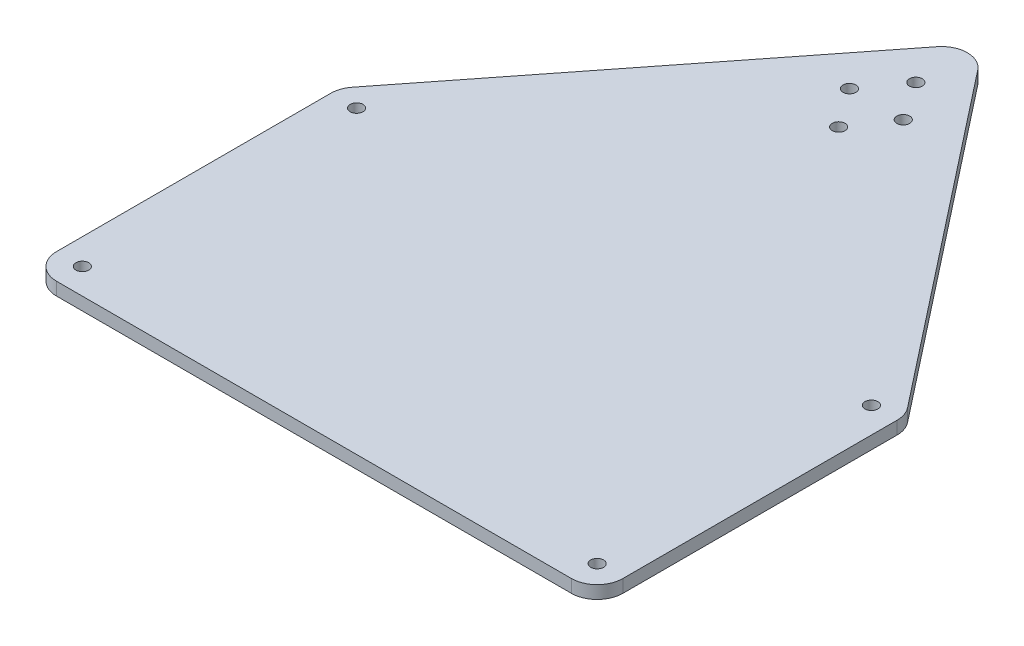
ISO-10303-21;
HEADER;
FILE_DESCRIPTION(('STEP AP214'),'2;1');
FILE_NAME('part.step','',(''),(''),'','','');
FILE_SCHEMA(('AUTOMOTIVE_DESIGN { 1 0 10303 214 1 1 1 1 }'));
ENDSEC;
DATA;
#1=APPLICATION_CONTEXT('core data for automotive mechanical design processes');
#2=APPLICATION_PROTOCOL_DEFINITION('international standard','automotive_design',2000,#1);
#3=PRODUCT_CONTEXT('',#1,'mechanical');
#4=PRODUCT('Part','Part','',(#3));
#5=PRODUCT_RELATED_PRODUCT_CATEGORY('part','',(#4));
#6=PRODUCT_DEFINITION_FORMATION('','',#4);
#7=PRODUCT_DEFINITION_CONTEXT('part definition',#1,'design');
#8=PRODUCT_DEFINITION('design','',#6,#7);
#9=PRODUCT_DEFINITION_SHAPE('','',#8);
#10=(LENGTH_UNIT() NAMED_UNIT(*) SI_UNIT(.MILLI.,.METRE.));
#11=(NAMED_UNIT(*) PLANE_ANGLE_UNIT() SI_UNIT($,.RADIAN.));
#12=(NAMED_UNIT(*) SI_UNIT($,.STERADIAN.) SOLID_ANGLE_UNIT());
#13=UNCERTAINTY_MEASURE_WITH_UNIT(LENGTH_MEASURE(1.E-05),#10,'distance_accuracy_value','');
#14=(GEOMETRIC_REPRESENTATION_CONTEXT(3) GLOBAL_UNCERTAINTY_ASSIGNED_CONTEXT((#13)) GLOBAL_UNIT_ASSIGNED_CONTEXT((#10,
#11,#12)) REPRESENTATION_CONTEXT('',''));
#15=CARTESIAN_POINT('',(0.,0.,0.));
#16=DIRECTION('',(0.,0.,1.));
#17=DIRECTION('',(1.,0.,0.));
#18=AXIS2_PLACEMENT_3D('',#15,#16,#17);
#19=CARTESIAN_POINT('',(-125.579322033898,6.35,-12.7));
#20=DIRECTION('',(0.,-1.,0.));
#21=DIRECTION('',(0.,0.,-1.));
#22=AXIS2_PLACEMENT_3D('',#19,#20,#21);
#23=PLANE('',#22);
#24=CARTESIAN_POINT('',(-125.579322033898,6.35,-12.7));
#25=DIRECTION('',(0.,1.,0.));
#26=DIRECTION('',(0.,0.,-1.));
#27=AXIS2_PLACEMENT_3D('',#24,#25,#26);
#28=CIRCLE('',#27,12.7);
#29=CARTESIAN_POINT('',(-138.279322033898,6.35,-12.7));
#30=VERTEX_POINT('',#29);
#31=CARTESIAN_POINT('',(-125.579322033898,6.35,0.));
#32=VERTEX_POINT('',#31);
#33=EDGE_CURVE('E161',#30,#32,#28,.T.);
#34=ORIENTED_EDGE('',*,*,#33,.T.);
#35=DIRECTION('',(1.,0.,0.));
#36=VECTOR('',#35,1.);
#37=CARTESIAN_POINT('',(-125.579322033898,6.35,0.));
#38=LINE('',#37,#36);
#39=CARTESIAN_POINT('',(128.420677966102,6.35,0.));
#40=VERTEX_POINT('',#39);
#41=EDGE_CURVE('E99',#32,#40,#38,.T.);
#42=ORIENTED_EDGE('',*,*,#41,.T.);
#43=CARTESIAN_POINT('',(128.420677966102,6.35,-12.7));
#44=DIRECTION('',(0.,1.,0.));
#45=DIRECTION('',(0.,0.,1.));
#46=AXIS2_PLACEMENT_3D('',#43,#44,#45);
#47=CIRCLE('',#46,12.7);
#48=CARTESIAN_POINT('',(141.120677966102,6.35,-12.7));
#49=VERTEX_POINT('',#48);
#50=EDGE_CURVE('E182',#40,#49,#47,.T.);
#51=ORIENTED_EDGE('',*,*,#50,.T.);
#52=DIRECTION('',(0.,0.,-1.));
#53=VECTOR('',#52,1.);
#54=CARTESIAN_POINT('',(141.120677966102,6.35,-12.7));
#55=LINE('',#54,#53);
#56=CARTESIAN_POINT('',(141.120677966102,6.35,-148.007538959317));
#57=VERTEX_POINT('',#56);
#58=EDGE_CURVE('E201',#49,#57,#55,.T.);
#59=ORIENTED_EDGE('',*,*,#58,.T.);
#60=CARTESIAN_POINT('',(128.420677966102,6.35,-148.007538959317));
#61=DIRECTION('',(0.,1.,0.));
#62=DIRECTION('',(0.,0.,1.));
#63=AXIS2_PLACEMENT_3D('',#60,#61,#62);
#64=CIRCLE('',#63,12.7);
#65=CARTESIAN_POINT('',(138.406920869146,6.35,-155.853872668852));
#66=VERTEX_POINT('',#65);
#67=EDGE_CURVE('E198',#57,#66,#64,.T.);
#68=ORIENTED_EDGE('',*,*,#67,.T.);
#69=DIRECTION('',(-0.617821551931903,0.,-0.786318338822423));
#70=VECTOR('',#69,1.);
#71=CARTESIAN_POINT('',(138.406920869146,6.35,-155.853872668852));
#72=LINE('',#71,#70);
#73=CARTESIAN_POINT('',(11.4069208691464,6.35,-317.490236305216));
#74=VERTEX_POINT('',#73);
#75=EDGE_CURVE('E200',#66,#74,#72,.T.);
#76=ORIENTED_EDGE('',*,*,#75,.T.);
#77=CARTESIAN_POINT('',(1.42067796610163,6.35,-309.643902595681));
#78=DIRECTION('',(0.,1.,0.));
#79=DIRECTION('',(0.,0.,1.));
#80=AXIS2_PLACEMENT_3D('',#77,#78,#79);
#81=CIRCLE('',#80,12.7);
#82=CARTESIAN_POINT('',(-8.56556493694314,6.35,-317.490236305216));
#83=VERTEX_POINT('',#82);
#84=EDGE_CURVE('E124',#74,#83,#81,.T.);
#85=ORIENTED_EDGE('',*,*,#84,.T.);
#86=DIRECTION('',(-0.617821551931904,0.,0.786318338822423));
#87=VECTOR('',#86,1.);
#88=CARTESIAN_POINT('',(-8.56556493694314,6.35,-317.490236305216));
#89=LINE('',#88,#87);
#90=CARTESIAN_POINT('',(-135.565564936943,6.35,-155.853872668852));
#91=VERTEX_POINT('',#90);
#92=EDGE_CURVE('E118',#83,#91,#89,.T.);
#93=ORIENTED_EDGE('',*,*,#92,.T.);
#94=CARTESIAN_POINT('',(-125.579322033898,6.35,-148.007538959317));
#95=DIRECTION('',(0.,1.,0.));
#96=DIRECTION('',(0.,0.,1.));
#97=AXIS2_PLACEMENT_3D('',#94,#95,#96);
#98=CIRCLE('',#97,12.7);
#99=CARTESIAN_POINT('',(-138.279322033898,6.35,-148.007538959317));
#100=VERTEX_POINT('',#99);
#101=EDGE_CURVE('E122',#91,#100,#98,.T.);
#102=ORIENTED_EDGE('',*,*,#101,.T.);
#103=DIRECTION('',(0.,0.,1.));
#104=VECTOR('',#103,1.);
#105=CARTESIAN_POINT('',(-138.279322033898,6.35,-148.007538959317));
#106=LINE('',#105,#104);
#107=EDGE_CURVE('E50',#100,#30,#106,.T.);
#108=ORIENTED_EDGE('',*,*,#107,.T.);
#109=EDGE_LOOP('',(#34,#42,#51,#59,#68,#76,#85,#93,#102,#108));
#110=FACE_BOUND('',#109,.T.);
#111=CARTESIAN_POINT('',(1.42067796610163,6.35,-296.943902595681));
#112=DIRECTION('',(0.,1.,0.));
#113=DIRECTION('',(0.,0.,1.));
#114=AXIS2_PLACEMENT_3D('',#111,#112,#113);
#115=CIRCLE('',#114,3.175);
#116=CARTESIAN_POINT('',(1.42067796610163,6.35,-293.768902595681));
#117=VERTEX_POINT('',#116);
#118=EDGE_CURVE('E146',#117,#117,#115,.T.);
#119=ORIENTED_EDGE('',*,*,#118,.F.);
#120=EDGE_LOOP('',(#119));
#121=FACE_BOUND('',#120,.T.);
#122=CARTESIAN_POINT('',(-12.2950626967712,6.35,-277.893902595681));
#123=DIRECTION('',(0.,1.,0.));
#124=DIRECTION('',(0.,0.,1.));
#125=AXIS2_PLACEMENT_3D('',#122,#123,#124);
#126=CIRCLE('',#125,3.175);
#127=CARTESIAN_POINT('',(-12.2950626967712,6.35,-274.718902595681));
#128=VERTEX_POINT('',#127);
#129=EDGE_CURVE('E212',#128,#128,#126,.T.);
#130=ORIENTED_EDGE('',*,*,#129,.F.);
#131=EDGE_LOOP('',(#130));
#132=FACE_BOUND('',#131,.T.);
#133=CARTESIAN_POINT('',(14.2584082263258,6.35,-277.893902595681));
#134=DIRECTION('',(0.,1.,0.));
#135=DIRECTION('',(0.,0.,1.));
#136=AXIS2_PLACEMENT_3D('',#133,#134,#135);
#137=CIRCLE('',#136,3.175);
#138=CARTESIAN_POINT('',(14.2584082263258,6.35,-274.718902595681));
#139=VERTEX_POINT('',#138);
#140=EDGE_CURVE('E218',#139,#139,#137,.T.);
#141=ORIENTED_EDGE('',*,*,#140,.F.);
#142=EDGE_LOOP('',(#141));
#143=FACE_BOUND('',#142,.T.);
#144=CARTESIAN_POINT('',(1.42067796610163,6.35,-258.843902595681));
#145=DIRECTION('',(0.,1.,0.));
#146=DIRECTION('',(0.,0.,1.));
#147=AXIS2_PLACEMENT_3D('',#144,#145,#146);
#148=CIRCLE('',#147,3.175);
#149=CARTESIAN_POINT('',(1.42067796610163,6.35,-255.668902595681));
#150=VERTEX_POINT('',#149);
#151=EDGE_CURVE('E224',#150,#150,#148,.T.);
#152=ORIENTED_EDGE('',*,*,#151,.F.);
#153=EDGE_LOOP('',(#152));
#154=FACE_BOUND('',#153,.T.);
#155=CARTESIAN_POINT('',(-125.579322033898,6.35,-148.007538959317));
#156=DIRECTION('',(0.,1.,0.));
#157=DIRECTION('',(0.,0.,1.));
#158=AXIS2_PLACEMENT_3D('',#155,#156,#157);
#159=CIRCLE('',#158,3.175);
#160=CARTESIAN_POINT('',(-125.579322033898,6.35,-144.832538959317));
#161=VERTEX_POINT('',#160);
#162=EDGE_CURVE('E230',#161,#161,#159,.T.);
#163=ORIENTED_EDGE('',*,*,#162,.F.);
#164=EDGE_LOOP('',(#163));
#165=FACE_BOUND('',#164,.T.);
#166=CARTESIAN_POINT('',(128.420677966102,6.35,-148.007538959317));
#167=DIRECTION('',(0.,1.,0.));
#168=DIRECTION('',(0.,0.,1.));
#169=AXIS2_PLACEMENT_3D('',#166,#167,#168);
#170=CIRCLE('',#169,3.175);
#171=CARTESIAN_POINT('',(128.420677966102,6.35,-144.832538959317));
#172=VERTEX_POINT('',#171);
#173=EDGE_CURVE('E236',#172,#172,#170,.T.);
#174=ORIENTED_EDGE('',*,*,#173,.F.);
#175=EDGE_LOOP('',(#174));
#176=FACE_BOUND('',#175,.T.);
#177=CARTESIAN_POINT('',(128.420677966102,6.35,-12.7));
#178=DIRECTION('',(0.,1.,0.));
#179=DIRECTION('',(0.,0.,1.));
#180=AXIS2_PLACEMENT_3D('',#177,#178,#179);
#181=CIRCLE('',#180,3.175);
#182=CARTESIAN_POINT('',(128.420677966102,6.35,-9.525));
#183=VERTEX_POINT('',#182);
#184=EDGE_CURVE('E242',#183,#183,#181,.T.);
#185=ORIENTED_EDGE('',*,*,#184,.F.);
#186=EDGE_LOOP('',(#185));
#187=FACE_BOUND('',#186,.T.);
#188=CARTESIAN_POINT('',(-125.579322033898,6.35,-12.7));
#189=DIRECTION('',(0.,1.,0.));
#190=DIRECTION('',(0.,0.,1.));
#191=AXIS2_PLACEMENT_3D('',#188,#189,#190);
#192=CIRCLE('',#191,3.175);
#193=CARTESIAN_POINT('',(-125.579322033898,6.35,-9.525));
#194=VERTEX_POINT('',#193);
#195=EDGE_CURVE('E248',#194,#194,#192,.T.);
#196=ORIENTED_EDGE('',*,*,#195,.F.);
#197=EDGE_LOOP('',(#196));
#198=FACE_BOUND('',#197,.T.);
#199=ADVANCED_FACE('F33',(#110,#121,#132,#143,#154,#165,#176,#187,#198),#23,.F.);
#200=CARTESIAN_POINT('',(-125.579322033898,0.,-12.7));
#201=DIRECTION('',(0.,-1.,0.));
#202=DIRECTION('',(0.,0.,-1.));
#203=AXIS2_PLACEMENT_3D('',#200,#201,#202);
#204=PLANE('',#203);
#205=CARTESIAN_POINT('',(128.420677966102,0.,-12.7));
#206=DIRECTION('',(0.,1.,0.));
#207=DIRECTION('',(0.,0.,1.));
#208=AXIS2_PLACEMENT_3D('',#205,#206,#207);
#209=CIRCLE('',#208,3.175);
#210=CARTESIAN_POINT('',(128.420677966102,0.,-9.525));
#211=VERTEX_POINT('',#210);
#212=EDGE_CURVE('E245',#211,#211,#209,.T.);
#213=ORIENTED_EDGE('',*,*,#212,.T.);
#214=EDGE_LOOP('',(#213));
#215=FACE_BOUND('',#214,.T.);
#216=CARTESIAN_POINT('',(-125.579322033898,0.,-148.007538959317));
#217=DIRECTION('',(0.,1.,0.));
#218=DIRECTION('',(0.,0.,1.));
#219=AXIS2_PLACEMENT_3D('',#216,#217,#218);
#220=CIRCLE('',#219,3.175);
#221=CARTESIAN_POINT('',(-125.579322033898,0.,-144.832538959317));
#222=VERTEX_POINT('',#221);
#223=EDGE_CURVE('E233',#222,#222,#220,.T.);
#224=ORIENTED_EDGE('',*,*,#223,.T.);
#225=EDGE_LOOP('',(#224));
#226=FACE_BOUND('',#225,.T.);
#227=CARTESIAN_POINT('',(14.2584082263258,0.,-277.893902595681));
#228=DIRECTION('',(0.,1.,0.));
#229=DIRECTION('',(0.,0.,1.));
#230=AXIS2_PLACEMENT_3D('',#227,#228,#229);
#231=CIRCLE('',#230,3.175);
#232=CARTESIAN_POINT('',(14.2584082263258,0.,-274.718902595681));
#233=VERTEX_POINT('',#232);
#234=EDGE_CURVE('E221',#233,#233,#231,.T.);
#235=ORIENTED_EDGE('',*,*,#234,.T.);
#236=EDGE_LOOP('',(#235));
#237=FACE_BOUND('',#236,.T.);
#238=CARTESIAN_POINT('',(1.42067796610163,0.,-296.943902595681));
#239=DIRECTION('',(0.,1.,0.));
#240=DIRECTION('',(0.,0.,1.));
#241=AXIS2_PLACEMENT_3D('',#238,#239,#240);
#242=CIRCLE('',#241,3.175);
#243=CARTESIAN_POINT('',(1.42067796610163,0.,-293.768902595681));
#244=VERTEX_POINT('',#243);
#245=EDGE_CURVE('E209',#244,#244,#242,.T.);
#246=ORIENTED_EDGE('',*,*,#245,.T.);
#247=EDGE_LOOP('',(#246));
#248=FACE_BOUND('',#247,.T.);
#249=CARTESIAN_POINT('',(-125.579322033898,0.,-12.7));
#250=DIRECTION('',(0.,1.,0.));
#251=DIRECTION('',(0.,0.,-1.));
#252=AXIS2_PLACEMENT_3D('',#249,#250,#251);
#253=CIRCLE('',#252,12.7);
#254=CARTESIAN_POINT('',(-138.279322033898,0.,-12.7));
#255=VERTEX_POINT('',#254);
#256=CARTESIAN_POINT('',(-125.579322033898,0.,0.));
#257=VERTEX_POINT('',#256);
#258=EDGE_CURVE('E142',#255,#257,#253,.T.);
#259=ORIENTED_EDGE('',*,*,#258,.F.);
#260=DIRECTION('',(0.,0.,1.));
#261=VECTOR('',#260,1.);
#262=CARTESIAN_POINT('',(-138.279322033898,0.,-148.007538959317));
#263=LINE('',#262,#261);
#264=CARTESIAN_POINT('',(-138.279322033898,0.,-148.007538959317));
#265=VERTEX_POINT('',#264);
#266=EDGE_CURVE('E91',#265,#255,#263,.T.);
#267=ORIENTED_EDGE('',*,*,#266,.F.);
#268=CARTESIAN_POINT('',(-125.579322033898,0.,-148.007538959317));
#269=DIRECTION('',(0.,1.,0.));
#270=DIRECTION('',(0.,0.,1.));
#271=AXIS2_PLACEMENT_3D('',#268,#269,#270);
#272=CIRCLE('',#271,12.7);
#273=CARTESIAN_POINT('',(-135.565564936943,0.,-155.853872668852));
#274=VERTEX_POINT('',#273);
#275=EDGE_CURVE('E85',#274,#265,#272,.T.);
#276=ORIENTED_EDGE('',*,*,#275,.F.);
#277=DIRECTION('',(-0.617821551931904,0.,0.786318338822423));
#278=VECTOR('',#277,1.);
#279=CARTESIAN_POINT('',(-8.56556493694314,0.,-317.490236305216));
#280=LINE('',#279,#278);
#281=CARTESIAN_POINT('',(-8.56556493694314,0.,-317.490236305216));
#282=VERTEX_POINT('',#281);
#283=EDGE_CURVE('E132',#282,#274,#280,.T.);
#284=ORIENTED_EDGE('',*,*,#283,.F.);
#285=CARTESIAN_POINT('',(1.42067796610163,0.,-309.643902595681));
#286=DIRECTION('',(0.,1.,0.));
#287=DIRECTION('',(0.,0.,1.));
#288=AXIS2_PLACEMENT_3D('',#285,#286,#287);
#289=CIRCLE('',#288,12.7);
#290=CARTESIAN_POINT('',(11.4069208691464,0.,-317.490236305216));
#291=VERTEX_POINT('',#290);
#292=EDGE_CURVE('E156',#291,#282,#289,.T.);
#293=ORIENTED_EDGE('',*,*,#292,.F.);
#294=DIRECTION('',(-0.617821551931903,0.,-0.786318338822423));
#295=VECTOR('',#294,1.);
#296=CARTESIAN_POINT('',(138.406920869146,0.,-155.853872668852));
#297=LINE('',#296,#295);
#298=CARTESIAN_POINT('',(138.406920869146,0.,-155.853872668852));
#299=VERTEX_POINT('',#298);
#300=EDGE_CURVE('E154',#299,#291,#297,.T.);
#301=ORIENTED_EDGE('',*,*,#300,.F.);
#302=CARTESIAN_POINT('',(128.420677966102,0.,-148.007538959317));
#303=DIRECTION('',(0.,1.,0.));
#304=DIRECTION('',(0.,0.,1.));
#305=AXIS2_PLACEMENT_3D('',#302,#303,#304);
#306=CIRCLE('',#305,12.7);
#307=CARTESIAN_POINT('',(141.120677966102,0.,-148.007538959317));
#308=VERTEX_POINT('',#307);
#309=EDGE_CURVE('E152',#308,#299,#306,.T.);
#310=ORIENTED_EDGE('',*,*,#309,.F.);
#311=DIRECTION('',(0.,0.,-1.));
#312=VECTOR('',#311,1.);
#313=CARTESIAN_POINT('',(141.120677966102,0.,-12.7));
#314=LINE('',#313,#312);
#315=CARTESIAN_POINT('',(141.120677966102,0.,-12.7));
#316=VERTEX_POINT('',#315);
#317=EDGE_CURVE('E150',#316,#308,#314,.T.);
#318=ORIENTED_EDGE('',*,*,#317,.F.);
#319=CARTESIAN_POINT('',(128.420677966102,0.,-12.7));
#320=DIRECTION('',(0.,1.,0.));
#321=DIRECTION('',(0.,0.,1.));
#322=AXIS2_PLACEMENT_3D('',#319,#320,#321);
#323=CIRCLE('',#322,12.7);
#324=CARTESIAN_POINT('',(128.420677966102,0.,0.));
#325=VERTEX_POINT('',#324);
#326=EDGE_CURVE('E148',#325,#316,#323,.T.);
#327=ORIENTED_EDGE('',*,*,#326,.F.);
#328=DIRECTION('',(1.,0.,0.));
#329=VECTOR('',#328,1.);
#330=CARTESIAN_POINT('',(-125.579322033898,0.,0.));
#331=LINE('',#330,#329);
#332=EDGE_CURVE('E145',#257,#325,#331,.T.);
#333=ORIENTED_EDGE('',*,*,#332,.F.);
#334=EDGE_LOOP('',(#259,#267,#276,#284,#293,#301,#310,#318,#327,#333));
#335=FACE_BOUND('',#334,.T.);
#336=CARTESIAN_POINT('',(-12.2950626967712,0.,-277.893902595681));
#337=DIRECTION('',(0.,1.,0.));
#338=DIRECTION('',(0.,0.,1.));
#339=AXIS2_PLACEMENT_3D('',#336,#337,#338);
#340=CIRCLE('',#339,3.175);
#341=CARTESIAN_POINT('',(-12.2950626967712,0.,-274.718902595681));
#342=VERTEX_POINT('',#341);
#343=EDGE_CURVE('E215',#342,#342,#340,.T.);
#344=ORIENTED_EDGE('',*,*,#343,.T.);
#345=EDGE_LOOP('',(#344));
#346=FACE_BOUND('',#345,.T.);
#347=CARTESIAN_POINT('',(1.42067796610163,0.,-258.843902595681));
#348=DIRECTION('',(0.,1.,0.));
#349=DIRECTION('',(0.,0.,1.));
#350=AXIS2_PLACEMENT_3D('',#347,#348,#349);
#351=CIRCLE('',#350,3.175);
#352=CARTESIAN_POINT('',(1.42067796610163,0.,-255.668902595681));
#353=VERTEX_POINT('',#352);
#354=EDGE_CURVE('E227',#353,#353,#351,.T.);
#355=ORIENTED_EDGE('',*,*,#354,.T.);
#356=EDGE_LOOP('',(#355));
#357=FACE_BOUND('',#356,.T.);
#358=CARTESIAN_POINT('',(128.420677966102,0.,-148.007538959317));
#359=DIRECTION('',(0.,1.,0.));
#360=DIRECTION('',(0.,0.,1.));
#361=AXIS2_PLACEMENT_3D('',#358,#359,#360);
#362=CIRCLE('',#361,3.175);
#363=CARTESIAN_POINT('',(128.420677966102,0.,-144.832538959317));
#364=VERTEX_POINT('',#363);
#365=EDGE_CURVE('E239',#364,#364,#362,.T.);
#366=ORIENTED_EDGE('',*,*,#365,.T.);
#367=EDGE_LOOP('',(#366));
#368=FACE_BOUND('',#367,.T.);
#369=CARTESIAN_POINT('',(-125.579322033898,0.,-12.7));
#370=DIRECTION('',(0.,1.,0.));
#371=DIRECTION('',(0.,0.,1.));
#372=AXIS2_PLACEMENT_3D('',#369,#370,#371);
#373=CIRCLE('',#372,3.175);
#374=CARTESIAN_POINT('',(-125.579322033898,0.,-9.525));
#375=VERTEX_POINT('',#374);
#376=EDGE_CURVE('E251',#375,#375,#373,.T.);
#377=ORIENTED_EDGE('',*,*,#376,.T.);
#378=EDGE_LOOP('',(#377));
#379=FACE_BOUND('',#378,.T.);
#380=ADVANCED_FACE('F186',(#215,#226,#237,#248,#335,#346,#357,#368,#379),#204,.T.);
#381=CARTESIAN_POINT('',(-125.579322033898,6.35,-12.7));
#382=DIRECTION('',(0.,-1.,0.));
#383=DIRECTION('',(0.,0.,-1.));
#384=AXIS2_PLACEMENT_3D('',#381,#382,#383);
#385=CYLINDRICAL_SURFACE('',#384,12.7);
#386=ORIENTED_EDGE('',*,*,#258,.T.);
#387=DIRECTION('',(0.,-1.,0.));
#388=VECTOR('',#387,1.);
#389=CARTESIAN_POINT('',(-125.579322033898,6.35,0.));
#390=LINE('',#389,#388);
#391=EDGE_CURVE('E11',#32,#257,#390,.T.);
#392=ORIENTED_EDGE('',*,*,#391,.F.);
#393=ORIENTED_EDGE('',*,*,#33,.F.);
#394=DIRECTION('',(0.,-1.,0.));
#395=VECTOR('',#394,1.);
#396=CARTESIAN_POINT('',(-138.279322033898,6.35,-12.7));
#397=LINE('',#396,#395);
#398=EDGE_CURVE('E138',#30,#255,#397,.T.);
#399=ORIENTED_EDGE('',*,*,#398,.T.);
#400=EDGE_LOOP('',(#386,#392,#393,#399));
#401=FACE_BOUND('',#400,.T.);
#402=ADVANCED_FACE('F35',(#401),#385,.T.);
#403=CARTESIAN_POINT('',(-125.579322033898,6.35,0.));
#404=DIRECTION('',(0.,0.,-1.));
#405=DIRECTION('',(-1.,0.,0.));
#406=AXIS2_PLACEMENT_3D('',#403,#404,#405);
#407=PLANE('',#406);
#408=ORIENTED_EDGE('',*,*,#332,.T.);
#409=DIRECTION('',(0.,-1.,0.));
#410=VECTOR('',#409,1.);
#411=CARTESIAN_POINT('',(128.420677966102,6.35,0.));
#412=LINE('',#411,#410);
#413=EDGE_CURVE('E42',#40,#325,#412,.T.);
#414=ORIENTED_EDGE('',*,*,#413,.F.);
#415=ORIENTED_EDGE('',*,*,#41,.F.);
#416=ORIENTED_EDGE('',*,*,#391,.T.);
#417=EDGE_LOOP('',(#408,#414,#415,#416));
#418=FACE_BOUND('',#417,.T.);
#419=ADVANCED_FACE('F291',(#418),#407,.F.);
#420=CARTESIAN_POINT('',(128.420677966102,6.35,-12.7));
#421=DIRECTION('',(0.,-1.,0.));
#422=DIRECTION('',(0.,0.,-1.));
#423=AXIS2_PLACEMENT_3D('',#420,#421,#422);
#424=CYLINDRICAL_SURFACE('',#423,12.7);
#425=ORIENTED_EDGE('',*,*,#326,.T.);
#426=DIRECTION('',(0.,-1.,0.));
#427=VECTOR('',#426,1.);
#428=CARTESIAN_POINT('',(141.120677966102,6.35,-12.7));
#429=LINE('',#428,#427);
#430=EDGE_CURVE('E174',#49,#316,#429,.T.);
#431=ORIENTED_EDGE('',*,*,#430,.F.);
#432=ORIENTED_EDGE('',*,*,#50,.F.);
#433=ORIENTED_EDGE('',*,*,#413,.T.);
#434=EDGE_LOOP('',(#425,#431,#432,#433));
#435=FACE_BOUND('',#434,.T.);
#436=ADVANCED_FACE('F180',(#435),#424,.T.);
#437=CARTESIAN_POINT('',(141.120677966102,6.35,-12.7));
#438=DIRECTION('',(-1.,0.,0.));
#439=DIRECTION('',(0.,0.,1.));
#440=AXIS2_PLACEMENT_3D('',#437,#438,#439);
#441=PLANE('',#440);
#442=ORIENTED_EDGE('',*,*,#317,.T.);
#443=DIRECTION('',(0.,-1.,0.));
#444=VECTOR('',#443,1.);
#445=CARTESIAN_POINT('',(141.120677966102,6.35,-148.007538959317));
#446=LINE('',#445,#444);
#447=EDGE_CURVE('E171',#57,#308,#446,.T.);
#448=ORIENTED_EDGE('',*,*,#447,.F.);
#449=ORIENTED_EDGE('',*,*,#58,.F.);
#450=ORIENTED_EDGE('',*,*,#430,.T.);
#451=EDGE_LOOP('',(#442,#448,#449,#450));
#452=FACE_BOUND('',#451,.T.);
#453=ADVANCED_FACE('F192',(#452),#441,.F.);
#454=CARTESIAN_POINT('',(128.420677966102,6.35,-148.007538959317));
#455=DIRECTION('',(0.,-1.,0.));
#456=DIRECTION('',(0.,0.,-1.));
#457=AXIS2_PLACEMENT_3D('',#454,#455,#456);
#458=CYLINDRICAL_SURFACE('',#457,12.7);
#459=ORIENTED_EDGE('',*,*,#309,.T.);
#460=DIRECTION('',(0.,-1.,0.));
#461=VECTOR('',#460,1.);
#462=CARTESIAN_POINT('',(138.406920869146,6.35,-155.853872668852));
#463=LINE('',#462,#461);
#464=EDGE_CURVE('E168',#66,#299,#463,.T.);
#465=ORIENTED_EDGE('',*,*,#464,.F.);
#466=ORIENTED_EDGE('',*,*,#67,.F.);
#467=ORIENTED_EDGE('',*,*,#447,.T.);
#468=EDGE_LOOP('',(#459,#465,#466,#467));
#469=FACE_BOUND('',#468,.T.);
#470=ADVANCED_FACE('F196',(#469),#458,.T.);
#471=CARTESIAN_POINT('',(138.406920869146,6.35,-155.853872668852));
#472=DIRECTION('',(-0.786318338822423,0.,0.617821551931903));
#473=DIRECTION('',(0.617821551931903,0.,0.786318338822423));
#474=AXIS2_PLACEMENT_3D('',#471,#472,#473);
#475=PLANE('',#474);
#476=ORIENTED_EDGE('',*,*,#300,.T.);
#477=DIRECTION('',(0.,-1.,0.));
#478=VECTOR('',#477,1.);
#479=CARTESIAN_POINT('',(11.4069208691464,6.35,-317.490236305216));
#480=LINE('',#479,#478);
#481=EDGE_CURVE('E165',#74,#291,#480,.T.);
#482=ORIENTED_EDGE('',*,*,#481,.F.);
#483=ORIENTED_EDGE('',*,*,#75,.F.);
#484=ORIENTED_EDGE('',*,*,#464,.T.);
#485=EDGE_LOOP('',(#476,#482,#483,#484));
#486=FACE_BOUND('',#485,.T.);
#487=ADVANCED_FACE('F281',(#486),#475,.F.);
#488=CARTESIAN_POINT('',(1.42067796610163,6.35,-309.643902595681));
#489=DIRECTION('',(0.,-1.,0.));
#490=DIRECTION('',(0.,0.,-1.));
#491=AXIS2_PLACEMENT_3D('',#488,#489,#490);
#492=CYLINDRICAL_SURFACE('',#491,12.7);
#493=ORIENTED_EDGE('',*,*,#292,.T.);
#494=DIRECTION('',(0.,-1.,0.));
#495=VECTOR('',#494,1.);
#496=CARTESIAN_POINT('',(-8.56556493694314,6.35,-317.490236305216));
#497=LINE('',#496,#495);
#498=EDGE_CURVE('E133',#83,#282,#497,.T.);
#499=ORIENTED_EDGE('',*,*,#498,.F.);
#500=ORIENTED_EDGE('',*,*,#84,.F.);
#501=ORIENTED_EDGE('',*,*,#481,.T.);
#502=EDGE_LOOP('',(#493,#499,#500,#501));
#503=FACE_BOUND('',#502,.T.);
#504=ADVANCED_FACE('F278',(#503),#492,.T.);
#505=CARTESIAN_POINT('',(-8.56556493694314,6.35,-317.490236305216));
#506=DIRECTION('',(0.786318338822422,0.,0.617821551931904));
#507=DIRECTION('',(0.617821551931904,0.,-0.786318338822423));
#508=AXIS2_PLACEMENT_3D('',#505,#506,#507);
#509=PLANE('',#508);
#510=ORIENTED_EDGE('',*,*,#283,.T.);
#511=DIRECTION('',(0.,-1.,0.));
#512=VECTOR('',#511,1.);
#513=CARTESIAN_POINT('',(-135.565564936943,6.35,-155.853872668852));
#514=LINE('',#513,#512);
#515=EDGE_CURVE('E129',#91,#274,#514,.T.);
#516=ORIENTED_EDGE('',*,*,#515,.F.);
#517=ORIENTED_EDGE('',*,*,#92,.F.);
#518=ORIENTED_EDGE('',*,*,#498,.T.);
#519=EDGE_LOOP('',(#510,#516,#517,#518));
#520=FACE_BOUND('',#519,.T.);
#521=ADVANCED_FACE('F130',(#520),#509,.F.);
#522=CARTESIAN_POINT('',(-125.579322033898,6.35,-148.007538959317));
#523=DIRECTION('',(0.,-1.,0.));
#524=DIRECTION('',(0.,0.,-1.));
#525=AXIS2_PLACEMENT_3D('',#522,#523,#524);
#526=CYLINDRICAL_SURFACE('',#525,12.7);
#527=ORIENTED_EDGE('',*,*,#275,.T.);
#528=DIRECTION('',(0.,-1.,0.));
#529=VECTOR('',#528,1.);
#530=CARTESIAN_POINT('',(-138.279322033898,6.35,-148.007538959317));
#531=LINE('',#530,#529);
#532=EDGE_CURVE('E134',#100,#265,#531,.T.);
#533=ORIENTED_EDGE('',*,*,#532,.F.);
#534=ORIENTED_EDGE('',*,*,#101,.F.);
#535=ORIENTED_EDGE('',*,*,#515,.T.);
#536=EDGE_LOOP('',(#527,#533,#534,#535));
#537=FACE_BOUND('',#536,.T.);
#538=ADVANCED_FACE('F136',(#537),#526,.T.);
#539=CARTESIAN_POINT('',(-138.279322033898,6.35,-148.007538959317));
#540=DIRECTION('',(1.,0.,0.));
#541=DIRECTION('',(0.,0.,-1.));
#542=AXIS2_PLACEMENT_3D('',#539,#540,#541);
#543=PLANE('',#542);
#544=ORIENTED_EDGE('',*,*,#266,.T.);
#545=ORIENTED_EDGE('',*,*,#398,.F.);
#546=ORIENTED_EDGE('',*,*,#107,.F.);
#547=ORIENTED_EDGE('',*,*,#532,.T.);
#548=EDGE_LOOP('',(#544,#545,#546,#547));
#549=FACE_BOUND('',#548,.T.);
#550=ADVANCED_FACE('F271',(#549),#543,.F.);
#551=CARTESIAN_POINT('',(1.42067796610163,6.35,-296.943902595681));
#552=DIRECTION('',(0.,-1.,0.));
#553=DIRECTION('',(0.,0.,-1.));
#554=AXIS2_PLACEMENT_3D('',#551,#552,#553);
#555=CYLINDRICAL_SURFACE('',#554,3.175);
#556=ORIENTED_EDGE('',*,*,#118,.T.);
#557=EDGE_LOOP('',(#556));
#558=FACE_BOUND('',#557,.T.);
#559=ORIENTED_EDGE('',*,*,#245,.F.);
#560=EDGE_LOOP('',(#559));
#561=FACE_BOUND('',#560,.T.);
#562=ADVANCED_FACE('F268',(#558,#561),#555,.F.);
#563=CARTESIAN_POINT('',(-12.2950626967712,6.35,-277.893902595681));
#564=DIRECTION('',(0.,-1.,0.));
#565=DIRECTION('',(0.,0.,-1.));
#566=AXIS2_PLACEMENT_3D('',#563,#564,#565);
#567=CYLINDRICAL_SURFACE('',#566,3.175);
#568=ORIENTED_EDGE('',*,*,#129,.T.);
#569=EDGE_LOOP('',(#568));
#570=FACE_BOUND('',#569,.T.);
#571=ORIENTED_EDGE('',*,*,#343,.F.);
#572=EDGE_LOOP('',(#571));
#573=FACE_BOUND('',#572,.T.);
#574=ADVANCED_FACE('F367',(#570,#573),#567,.F.);
#575=CARTESIAN_POINT('',(14.2584082263258,6.35,-277.893902595681));
#576=DIRECTION('',(0.,-1.,0.));
#577=DIRECTION('',(0.,0.,-1.));
#578=AXIS2_PLACEMENT_3D('',#575,#576,#577);
#579=CYLINDRICAL_SURFACE('',#578,3.175);
#580=ORIENTED_EDGE('',*,*,#140,.T.);
#581=EDGE_LOOP('',(#580));
#582=FACE_BOUND('',#581,.T.);
#583=ORIENTED_EDGE('',*,*,#234,.F.);
#584=EDGE_LOOP('',(#583));
#585=FACE_BOUND('',#584,.T.);
#586=ADVANCED_FACE('F375',(#582,#585),#579,.F.);
#587=CARTESIAN_POINT('',(1.42067796610163,6.35,-258.843902595681));
#588=DIRECTION('',(0.,-1.,0.));
#589=DIRECTION('',(0.,0.,-1.));
#590=AXIS2_PLACEMENT_3D('',#587,#588,#589);
#591=CYLINDRICAL_SURFACE('',#590,3.175);
#592=ORIENTED_EDGE('',*,*,#151,.T.);
#593=EDGE_LOOP('',(#592));
#594=FACE_BOUND('',#593,.T.);
#595=ORIENTED_EDGE('',*,*,#354,.F.);
#596=EDGE_LOOP('',(#595));
#597=FACE_BOUND('',#596,.T.);
#598=ADVANCED_FACE('F383',(#594,#597),#591,.F.);
#599=CARTESIAN_POINT('',(-125.579322033898,6.35,-148.007538959317));
#600=DIRECTION('',(0.,-1.,0.));
#601=DIRECTION('',(0.,0.,-1.));
#602=AXIS2_PLACEMENT_3D('',#599,#600,#601);
#603=CYLINDRICAL_SURFACE('',#602,3.175);
#604=ORIENTED_EDGE('',*,*,#162,.T.);
#605=EDGE_LOOP('',(#604));
#606=FACE_BOUND('',#605,.T.);
#607=ORIENTED_EDGE('',*,*,#223,.F.);
#608=EDGE_LOOP('',(#607));
#609=FACE_BOUND('',#608,.T.);
#610=ADVANCED_FACE('F392',(#606,#609),#603,.F.);
#611=CARTESIAN_POINT('',(128.420677966102,6.35,-148.007538959317));
#612=DIRECTION('',(0.,-1.,0.));
#613=DIRECTION('',(0.,0.,-1.));
#614=AXIS2_PLACEMENT_3D('',#611,#612,#613);
#615=CYLINDRICAL_SURFACE('',#614,3.175);
#616=ORIENTED_EDGE('',*,*,#173,.T.);
#617=EDGE_LOOP('',(#616));
#618=FACE_BOUND('',#617,.T.);
#619=ORIENTED_EDGE('',*,*,#365,.F.);
#620=EDGE_LOOP('',(#619));
#621=FACE_BOUND('',#620,.T.);
#622=ADVANCED_FACE('F401',(#618,#621),#615,.F.);
#623=CARTESIAN_POINT('',(128.420677966102,6.35,-12.7));
#624=DIRECTION('',(0.,-1.,0.));
#625=DIRECTION('',(0.,0.,-1.));
#626=AXIS2_PLACEMENT_3D('',#623,#624,#625);
#627=CYLINDRICAL_SURFACE('',#626,3.175);
#628=ORIENTED_EDGE('',*,*,#184,.T.);
#629=EDGE_LOOP('',(#628));
#630=FACE_BOUND('',#629,.T.);
#631=ORIENTED_EDGE('',*,*,#212,.F.);
#632=EDGE_LOOP('',(#631));
#633=FACE_BOUND('',#632,.T.);
#634=ADVANCED_FACE('F410',(#630,#633),#627,.F.);
#635=CARTESIAN_POINT('',(-125.579322033898,6.35,-12.7));
#636=DIRECTION('',(0.,-1.,0.));
#637=DIRECTION('',(0.,0.,-1.));
#638=AXIS2_PLACEMENT_3D('',#635,#636,#637);
#639=CYLINDRICAL_SURFACE('',#638,3.175);
#640=ORIENTED_EDGE('',*,*,#195,.T.);
#641=EDGE_LOOP('',(#640));
#642=FACE_BOUND('',#641,.T.);
#643=ORIENTED_EDGE('',*,*,#376,.F.);
#644=EDGE_LOOP('',(#643));
#645=FACE_BOUND('',#644,.T.);
#646=ADVANCED_FACE('F257',(#642,#645),#639,.F.);
#647=CLOSED_SHELL('',(#199,#380,#402,#419,#436,#453,#470,#487,#504,#521,#538,#550,#562,#574,
#586,#598,#610,#622,#634,#646));
#648=MANIFOLD_SOLID_BREP('B2',#647);
#649=ADVANCED_BREP_SHAPE_REPRESENTATION('',(#18,#648),#14);
#650=SHAPE_DEFINITION_REPRESENTATION(#9,#649);
ENDSEC;
END-ISO-10303-21;
